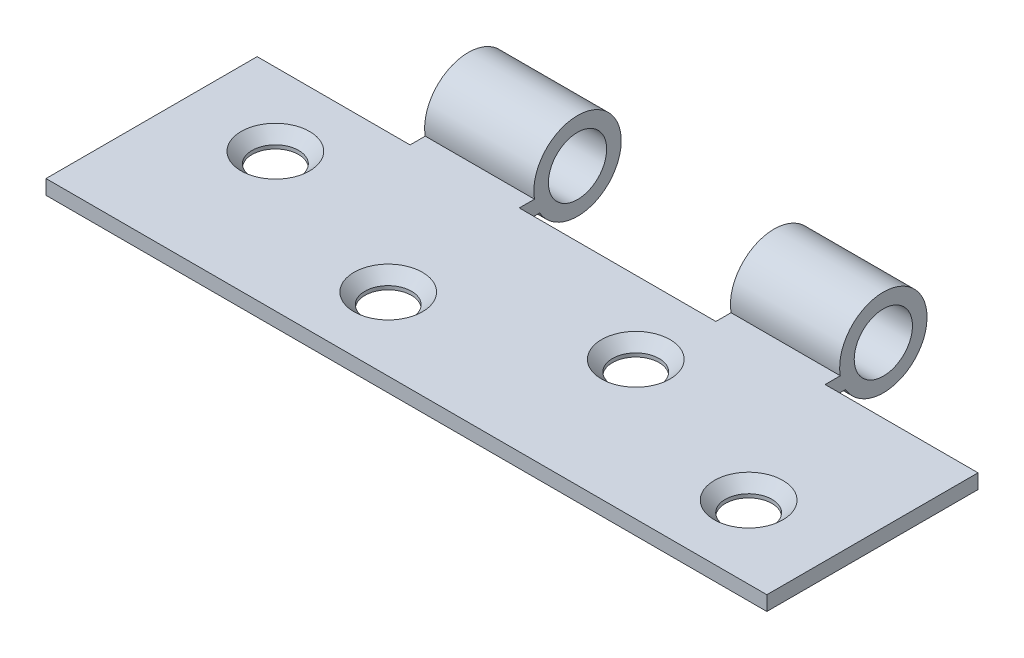
ISO-10303-21;
HEADER;
FILE_DESCRIPTION(('STEP AP214'),'2;1');
FILE_NAME('part.step','',(''),(''),'','','');
FILE_SCHEMA(('AUTOMOTIVE_DESIGN { 1 0 10303 214 1 1 1 1 }'));
ENDSEC;
DATA;
#1=APPLICATION_CONTEXT('core data for automotive mechanical design processes');
#2=APPLICATION_PROTOCOL_DEFINITION('international standard','automotive_design',2000,#1);
#3=PRODUCT_CONTEXT('',#1,'mechanical');
#4=PRODUCT('Part','Part','',(#3));
#5=PRODUCT_RELATED_PRODUCT_CATEGORY('part','',(#4));
#6=PRODUCT_DEFINITION_FORMATION('','',#4);
#7=PRODUCT_DEFINITION_CONTEXT('part definition',#1,'design');
#8=PRODUCT_DEFINITION('design','',#6,#7);
#9=PRODUCT_DEFINITION_SHAPE('','',#8);
#10=(LENGTH_UNIT() NAMED_UNIT(*) SI_UNIT(.MILLI.,.METRE.));
#11=(NAMED_UNIT(*) PLANE_ANGLE_UNIT() SI_UNIT($,.RADIAN.));
#12=(NAMED_UNIT(*) SI_UNIT($,.STERADIAN.) SOLID_ANGLE_UNIT());
#13=UNCERTAINTY_MEASURE_WITH_UNIT(LENGTH_MEASURE(1.E-05),#10,'distance_accuracy_value','');
#14=(GEOMETRIC_REPRESENTATION_CONTEXT(3) GLOBAL_UNCERTAINTY_ASSIGNED_CONTEXT((#13)) GLOBAL_UNIT_ASSIGNED_CONTEXT((#10,
#11,#12)) REPRESENTATION_CONTEXT('',''));
#15=CARTESIAN_POINT('',(0.,0.,0.));
#16=DIRECTION('',(0.,0.,1.));
#17=DIRECTION('',(1.,0.,0.));
#18=AXIS2_PLACEMENT_3D('',#15,#16,#17);
#19=CARTESIAN_POINT('',(99.,0.,0.));
#20=DIRECTION('',(-1.,0.,0.));
#21=DIRECTION('',(0.,0.,1.));
#22=AXIS2_PLACEMENT_3D('',#19,#20,#21);
#23=CYLINDRICAL_SURFACE('',#22,6.);
#24=CARTESIAN_POINT('',(36.,0.,0.));
#25=DIRECTION('',(-1.,0.,0.));
#26=DIRECTION('',(0.,0.,1.));
#27=AXIS2_PLACEMENT_3D('',#24,#25,#26);
#28=CIRCLE('',#27,6.);
#29=CARTESIAN_POINT('',(36.,-1.,5.91607978309962));
#30=VERTEX_POINT('',#29);
#31=CARTESIAN_POINT('',(36.,-3.00000000000001,5.19615242270663));
#32=VERTEX_POINT('',#31);
#33=EDGE_CURVE('E145',#30,#32,#28,.T.);
#34=ORIENTED_EDGE('',*,*,#33,.T.);
#35=DIRECTION('',(-1.,0.,0.));
#36=VECTOR('',#35,1.);
#37=CARTESIAN_POINT('',(99.,-3.,5.19615242270663));
#38=LINE('',#37,#36);
#39=CARTESIAN_POINT('',(21.,-3.00000000000001,5.19615242270663));
#40=VERTEX_POINT('',#39);
#41=EDGE_CURVE('E218',#40,#32,#38,.F.);
#42=ORIENTED_EDGE('',*,*,#41,.F.);
#43=CARTESIAN_POINT('',(21.,0.,0.));
#44=DIRECTION('',(1.,0.,0.));
#45=DIRECTION('',(0.,0.,-1.));
#46=AXIS2_PLACEMENT_3D('',#43,#44,#45);
#47=CIRCLE('',#46,6.);
#48=CARTESIAN_POINT('',(21.,-1.,5.91607978309962));
#49=VERTEX_POINT('',#48);
#50=EDGE_CURVE('E177',#40,#49,#47,.T.);
#51=ORIENTED_EDGE('',*,*,#50,.T.);
#52=DIRECTION('',(-1.,0.,0.));
#53=VECTOR('',#52,1.);
#54=CARTESIAN_POINT('',(99.,-1.,5.91607978309962));
#55=LINE('',#54,#53);
#56=EDGE_CURVE('E221',#30,#49,#55,.T.);
#57=ORIENTED_EDGE('',*,*,#56,.F.);
#58=EDGE_LOOP('',(#34,#42,#51,#57));
#59=FACE_BOUND('',#58,.T.);
#60=ADVANCED_FACE('F33',(#59),#23,.T.);
#61=CARTESIAN_POINT('',(63.,-3.,5.19615242270664));
#62=VERTEX_POINT('',#61);
#63=CARTESIAN_POINT('',(78.,-3.,5.19615242270664));
#64=VERTEX_POINT('',#63);
#65=EDGE_CURVE('E217',#62,#64,#38,.F.);
#66=ORIENTED_EDGE('',*,*,#65,.F.);
#67=CARTESIAN_POINT('',(63.,0.,0.));
#68=DIRECTION('',(1.,0.,0.));
#69=DIRECTION('',(0.,0.,-1.));
#70=AXIS2_PLACEMENT_3D('',#67,#68,#69);
#71=CIRCLE('',#70,6.);
#72=CARTESIAN_POINT('',(63.,-1.,5.91607978309962));
#73=VERTEX_POINT('',#72);
#74=EDGE_CURVE('E160',#62,#73,#71,.T.);
#75=ORIENTED_EDGE('',*,*,#74,.T.);
#76=CARTESIAN_POINT('',(78.,-1.,5.91607978309962));
#77=VERTEX_POINT('',#76);
#78=EDGE_CURVE('E223',#77,#73,#55,.T.);
#79=ORIENTED_EDGE('',*,*,#78,.F.);
#80=CARTESIAN_POINT('',(78.,0.,0.));
#81=DIRECTION('',(-1.,0.,0.));
#82=DIRECTION('',(0.,0.,1.));
#83=AXIS2_PLACEMENT_3D('',#80,#81,#82);
#84=CIRCLE('',#83,6.);
#85=EDGE_CURVE('E124',#77,#64,#84,.T.);
#86=ORIENTED_EDGE('',*,*,#85,.T.);
#87=EDGE_LOOP('',(#66,#75,#79,#86));
#88=FACE_BOUND('',#87,.T.);
#89=ADVANCED_FACE('F285',(#88),#23,.T.);
#90=CARTESIAN_POINT('',(99.,0.,0.));
#91=DIRECTION('',(-1.,0.,0.));
#92=DIRECTION('',(0.,0.,1.));
#93=AXIS2_PLACEMENT_3D('',#90,#91,#92);
#94=CYLINDRICAL_SURFACE('',#93,4.);
#95=CARTESIAN_POINT('',(36.,0.,0.));
#96=DIRECTION('',(-1.,0.,0.));
#97=DIRECTION('',(0.,0.,1.));
#98=AXIS2_PLACEMENT_3D('',#95,#96,#97);
#99=CIRCLE('',#98,4.);
#100=CARTESIAN_POINT('',(36.,0.,4.));
#101=VERTEX_POINT('',#100);
#102=EDGE_CURVE('E154',#101,#101,#99,.T.);
#103=ORIENTED_EDGE('',*,*,#102,.F.);
#104=EDGE_LOOP('',(#103));
#105=FACE_BOUND('',#104,.T.);
#106=CARTESIAN_POINT('',(21.,0.,0.));
#107=DIRECTION('',(1.,0.,0.));
#108=DIRECTION('',(0.,0.,-1.));
#109=AXIS2_PLACEMENT_3D('',#106,#107,#108);
#110=CIRCLE('',#109,4.);
#111=CARTESIAN_POINT('',(21.,0.,-4.));
#112=VERTEX_POINT('',#111);
#113=EDGE_CURVE('E183',#112,#112,#110,.T.);
#114=ORIENTED_EDGE('',*,*,#113,.F.);
#115=EDGE_LOOP('',(#114));
#116=FACE_BOUND('',#115,.T.);
#117=ADVANCED_FACE('F291',(#105,#116),#94,.F.);
#118=CARTESIAN_POINT('',(99.,0.,0.));
#119=DIRECTION('',(1.,0.,0.));
#120=DIRECTION('',(0.,0.,-1.));
#121=AXIS2_PLACEMENT_3D('',#118,#119,#120);
#122=PLANE('',#121);
#123=DIRECTION('',(0.,1.,0.));
#124=VECTOR('',#123,1.);
#125=CARTESIAN_POINT('',(99.,-6.,8.));
#126=LINE('',#125,#124);
#127=CARTESIAN_POINT('',(99.,-3.,8.));
#128=VERTEX_POINT('',#127);
#129=CARTESIAN_POINT('',(99.,-1.,8.));
#130=VERTEX_POINT('',#129);
#131=EDGE_CURVE('E138',#128,#130,#126,.T.);
#132=ORIENTED_EDGE('',*,*,#131,.T.);
#133=DIRECTION('',(0.,0.,-1.));
#134=VECTOR('',#133,1.);
#135=CARTESIAN_POINT('',(99.,-1.,37.));
#136=LINE('',#135,#134);
#137=CARTESIAN_POINT('',(99.,-1.,37.));
#138=VERTEX_POINT('',#137);
#139=EDGE_CURVE('E144',#138,#130,#136,.T.);
#140=ORIENTED_EDGE('',*,*,#139,.F.);
#141=DIRECTION('',(0.,1.,0.));
#142=VECTOR('',#141,1.);
#143=CARTESIAN_POINT('',(99.,-1.,37.));
#144=LINE('',#143,#142);
#145=CARTESIAN_POINT('',(99.,-3.,37.));
#146=VERTEX_POINT('',#145);
#147=EDGE_CURVE('E205',#146,#138,#144,.T.);
#148=ORIENTED_EDGE('',*,*,#147,.F.);
#149=DIRECTION('',(0.,0.,-1.));
#150=VECTOR('',#149,1.);
#151=CARTESIAN_POINT('',(99.,-3.,37.));
#152=LINE('',#151,#150);
#153=EDGE_CURVE('E208',#146,#128,#152,.T.);
#154=ORIENTED_EDGE('',*,*,#153,.T.);
#155=EDGE_LOOP('',(#132,#140,#148,#154));
#156=FACE_BOUND('',#155,.T.);
#157=ADVANCED_FACE('F339',(#156),#122,.T.);
#158=CARTESIAN_POINT('',(0.,0.,0.));
#159=DIRECTION('',(1.,0.,0.));
#160=DIRECTION('',(0.,0.,-1.));
#161=AXIS2_PLACEMENT_3D('',#158,#159,#160);
#162=PLANE('',#161);
#163=DIRECTION('',(0.,0.,-1.));
#164=VECTOR('',#163,1.);
#165=CARTESIAN_POINT('',(0.,-1.,37.));
#166=LINE('',#165,#164);
#167=CARTESIAN_POINT('',(0.,-1.,37.));
#168=VERTEX_POINT('',#167);
#169=CARTESIAN_POINT('',(0.,-1.,8.));
#170=VERTEX_POINT('',#169);
#171=EDGE_CURVE('E214',#168,#170,#166,.T.);
#172=ORIENTED_EDGE('',*,*,#171,.T.);
#173=DIRECTION('',(0.,1.,0.));
#174=VECTOR('',#173,1.);
#175=CARTESIAN_POINT('',(0.,-6.,8.));
#176=LINE('',#175,#174);
#177=CARTESIAN_POINT('',(0.,-3.00000000000001,8.));
#178=VERTEX_POINT('',#177);
#179=EDGE_CURVE('E169',#178,#170,#176,.T.);
#180=ORIENTED_EDGE('',*,*,#179,.F.);
#181=DIRECTION('',(0.,0.,-1.));
#182=VECTOR('',#181,1.);
#183=CARTESIAN_POINT('',(0.,-3.00000000000001,37.));
#184=LINE('',#183,#182);
#185=CARTESIAN_POINT('',(0.,-3.00000000000001,37.));
#186=VERTEX_POINT('',#185);
#187=EDGE_CURVE('E211',#186,#178,#184,.T.);
#188=ORIENTED_EDGE('',*,*,#187,.F.);
#189=DIRECTION('',(0.,-1.,0.));
#190=VECTOR('',#189,1.);
#191=CARTESIAN_POINT('',(0.,-1.,37.));
#192=LINE('',#191,#190);
#193=EDGE_CURVE('E201',#168,#186,#192,.T.);
#194=ORIENTED_EDGE('',*,*,#193,.F.);
#195=EDGE_LOOP('',(#172,#180,#188,#194));
#196=FACE_BOUND('',#195,.T.);
#197=ADVANCED_FACE('F274',(#196),#162,.F.);
#198=CARTESIAN_POINT('',(0.,-1.,37.));
#199=DIRECTION('',(0.,-1.,0.));
#200=DIRECTION('',(0.,0.,-1.));
#201=AXIS2_PLACEMENT_3D('',#198,#199,#200);
#202=PLANE('',#201);
#203=CARTESIAN_POINT('',(86.5,-1.,27.));
#204=DIRECTION('',(0.,-1.,0.));
#205=DIRECTION('',(0.,0.,-1.));
#206=AXIS2_PLACEMENT_3D('',#203,#204,#205);
#207=CIRCLE('',#206,4.69999999999997);
#208=CARTESIAN_POINT('',(86.5,-1.,22.3));
#209=VERTEX_POINT('',#208);
#210=EDGE_CURVE('E251',#209,#209,#207,.T.);
#211=ORIENTED_EDGE('',*,*,#210,.T.);
#212=EDGE_LOOP('',(#211));
#213=FACE_BOUND('',#212,.T.);
#214=CARTESIAN_POINT('',(62.,-1.,18.));
#215=DIRECTION('',(0.,-1.,0.));
#216=DIRECTION('',(0.,0.,-1.));
#217=AXIS2_PLACEMENT_3D('',#214,#215,#216);
#218=CIRCLE('',#217,4.69999999999996);
#219=CARTESIAN_POINT('',(62.,-1.,13.3));
#220=VERTEX_POINT('',#219);
#221=EDGE_CURVE('E248',#220,#220,#218,.T.);
#222=ORIENTED_EDGE('',*,*,#221,.T.);
#223=EDGE_LOOP('',(#222));
#224=FACE_BOUND('',#223,.T.);
#225=CARTESIAN_POINT('',(37.,-1.,27.));
#226=DIRECTION('',(0.,-1.,0.));
#227=DIRECTION('',(0.,0.,-1.));
#228=AXIS2_PLACEMENT_3D('',#225,#226,#227);
#229=CIRCLE('',#228,4.69999999999997);
#230=CARTESIAN_POINT('',(37.,-1.,22.3));
#231=VERTEX_POINT('',#230);
#232=EDGE_CURVE('E245',#231,#231,#229,.T.);
#233=ORIENTED_EDGE('',*,*,#232,.T.);
#234=EDGE_LOOP('',(#233));
#235=FACE_BOUND('',#234,.T.);
#236=CARTESIAN_POINT('',(12.5,-1.,18.));
#237=DIRECTION('',(0.,-1.,0.));
#238=DIRECTION('',(0.,0.,-1.));
#239=AXIS2_PLACEMENT_3D('',#236,#237,#238);
#240=CIRCLE('',#239,4.69999999999997);
#241=CARTESIAN_POINT('',(12.5,-1.,13.3));
#242=VERTEX_POINT('',#241);
#243=EDGE_CURVE('E242',#242,#242,#240,.T.);
#244=ORIENTED_EDGE('',*,*,#243,.T.);
#245=EDGE_LOOP('',(#244));
#246=FACE_BOUND('',#245,.T.);
#247=ORIENTED_EDGE('',*,*,#78,.T.);
#248=DIRECTION('',(0.,0.,1.));
#249=VECTOR('',#248,1.);
#250=CARTESIAN_POINT('',(63.,-1.,37.));
#251=LINE('',#250,#249);
#252=CARTESIAN_POINT('',(63.,-1.,8.));
#253=VERTEX_POINT('',#252);
#254=EDGE_CURVE('E163',#73,#253,#251,.T.);
#255=ORIENTED_EDGE('',*,*,#254,.T.);
#256=DIRECTION('',(-1.,0.,0.));
#257=VECTOR('',#256,1.);
#258=CARTESIAN_POINT('',(0.,-1.,8.));
#259=LINE('',#258,#257);
#260=CARTESIAN_POINT('',(36.,-1.,8.));
#261=VERTEX_POINT('',#260);
#262=EDGE_CURVE('E157',#253,#261,#259,.T.);
#263=ORIENTED_EDGE('',*,*,#262,.T.);
#264=DIRECTION('',(0.,0.,-1.));
#265=VECTOR('',#264,1.);
#266=CARTESIAN_POINT('',(36.,-1.,37.));
#267=LINE('',#266,#265);
#268=EDGE_CURVE('E147',#261,#30,#267,.T.);
#269=ORIENTED_EDGE('',*,*,#268,.T.);
#270=ORIENTED_EDGE('',*,*,#56,.T.);
#271=DIRECTION('',(0.,0.,1.));
#272=VECTOR('',#271,1.);
#273=CARTESIAN_POINT('',(21.,-1.,37.));
#274=LINE('',#273,#272);
#275=CARTESIAN_POINT('',(21.,-1.,7.99999999999999));
#276=VERTEX_POINT('',#275);
#277=EDGE_CURVE('E180',#49,#276,#274,.T.);
#278=ORIENTED_EDGE('',*,*,#277,.T.);
#279=DIRECTION('',(-1.,0.,0.));
#280=VECTOR('',#279,1.);
#281=CARTESIAN_POINT('',(0.,-1.,7.99999999999999));
#282=LINE('',#281,#280);
#283=EDGE_CURVE('E173',#276,#170,#282,.T.);
#284=ORIENTED_EDGE('',*,*,#283,.T.);
#285=ORIENTED_EDGE('',*,*,#171,.F.);
#286=DIRECTION('',(-1.,0.,0.));
#287=VECTOR('',#286,1.);
#288=CARTESIAN_POINT('',(0.,-1.,37.));
#289=LINE('',#288,#287);
#290=EDGE_CURVE('E198',#138,#168,#289,.T.);
#291=ORIENTED_EDGE('',*,*,#290,.F.);
#292=ORIENTED_EDGE('',*,*,#139,.T.);
#293=DIRECTION('',(-1.,0.,0.));
#294=VECTOR('',#293,1.);
#295=CARTESIAN_POINT('',(0.,-1.,7.99999999999999));
#296=LINE('',#295,#294);
#297=CARTESIAN_POINT('',(78.,-1.,7.99999999999999));
#298=VERTEX_POINT('',#297);
#299=EDGE_CURVE('E133',#130,#298,#296,.T.);
#300=ORIENTED_EDGE('',*,*,#299,.T.);
#301=DIRECTION('',(0.,0.,-1.));
#302=VECTOR('',#301,1.);
#303=CARTESIAN_POINT('',(78.,-1.,37.));
#304=LINE('',#303,#302);
#305=EDGE_CURVE('E122',#298,#77,#304,.T.);
#306=ORIENTED_EDGE('',*,*,#305,.T.);
#307=EDGE_LOOP('',(#247,#255,#263,#269,#270,#278,#284,#285,#291,#292,#300,#306));
#308=FACE_BOUND('',#307,.T.);
#309=ADVANCED_FACE('F141',(#213,#224,#235,#246,#308),#202,.F.);
#310=CARTESIAN_POINT('',(99.,-3.,37.));
#311=DIRECTION('',(0.,1.,0.));
#312=DIRECTION('',(-1.,0.,0.));
#313=AXIS2_PLACEMENT_3D('',#310,#311,#312);
#314=PLANE('',#313);
#315=CARTESIAN_POINT('',(37.,-3.00000000000001,27.));
#316=DIRECTION('',(0.,-1.,0.));
#317=DIRECTION('',(1.,0.,0.));
#318=AXIS2_PLACEMENT_3D('',#315,#316,#317);
#319=CIRCLE('',#318,3.2);
#320=CARTESIAN_POINT('',(40.2,-3.00000000000001,27.));
#321=VERTEX_POINT('',#320);
#322=EDGE_CURVE('E187',#321,#321,#319,.T.);
#323=ORIENTED_EDGE('',*,*,#322,.F.);
#324=EDGE_LOOP('',(#323));
#325=FACE_BOUND('',#324,.T.);
#326=CARTESIAN_POINT('',(62.,-3.,18.));
#327=DIRECTION('',(0.,-1.,0.));
#328=DIRECTION('',(1.,0.,0.));
#329=AXIS2_PLACEMENT_3D('',#326,#327,#328);
#330=CIRCLE('',#329,3.2);
#331=CARTESIAN_POINT('',(65.2,-3.,18.));
#332=VERTEX_POINT('',#331);
#333=EDGE_CURVE('E191',#332,#332,#330,.T.);
#334=ORIENTED_EDGE('',*,*,#333,.F.);
#335=EDGE_LOOP('',(#334));
#336=FACE_BOUND('',#335,.T.);
#337=CARTESIAN_POINT('',(86.5,-3.,27.));
#338=DIRECTION('',(0.,-1.,0.));
#339=DIRECTION('',(1.,0.,0.));
#340=AXIS2_PLACEMENT_3D('',#337,#338,#339);
#341=CIRCLE('',#340,3.2);
#342=CARTESIAN_POINT('',(89.7,-3.,27.));
#343=VERTEX_POINT('',#342);
#344=EDGE_CURVE('E186',#343,#343,#341,.T.);
#345=ORIENTED_EDGE('',*,*,#344,.F.);
#346=EDGE_LOOP('',(#345));
#347=FACE_BOUND('',#346,.T.);
#348=CARTESIAN_POINT('',(12.5,-3.00000000000001,18.));
#349=DIRECTION('',(0.,-1.,0.));
#350=DIRECTION('',(1.,0.,0.));
#351=AXIS2_PLACEMENT_3D('',#348,#349,#350);
#352=CIRCLE('',#351,3.2);
#353=CARTESIAN_POINT('',(15.7,-3.00000000000001,18.));
#354=VERTEX_POINT('',#353);
#355=EDGE_CURVE('E190',#354,#354,#352,.T.);
#356=ORIENTED_EDGE('',*,*,#355,.F.);
#357=EDGE_LOOP('',(#356));
#358=FACE_BOUND('',#357,.T.);
#359=DIRECTION('',(1.,0.,0.));
#360=VECTOR('',#359,1.);
#361=CARTESIAN_POINT('',(99.,-3.,8.));
#362=LINE('',#361,#360);
#363=CARTESIAN_POINT('',(36.,-3.00000000000001,8.));
#364=VERTEX_POINT('',#363);
#365=CARTESIAN_POINT('',(63.,-3.00000000000001,8.));
#366=VERTEX_POINT('',#365);
#367=EDGE_CURVE('E236',#364,#366,#362,.T.);
#368=ORIENTED_EDGE('',*,*,#367,.T.);
#369=DIRECTION('',(0.,0.,-1.));
#370=VECTOR('',#369,1.);
#371=CARTESIAN_POINT('',(63.,-3.,37.));
#372=LINE('',#371,#370);
#373=EDGE_CURVE('E239',#366,#62,#372,.T.);
#374=ORIENTED_EDGE('',*,*,#373,.T.);
#375=ORIENTED_EDGE('',*,*,#65,.T.);
#376=DIRECTION('',(0.,0.,1.));
#377=VECTOR('',#376,1.);
#378=CARTESIAN_POINT('',(78.,-3.,37.));
#379=LINE('',#378,#377);
#380=CARTESIAN_POINT('',(78.,-3.,7.99999999999999));
#381=VERTEX_POINT('',#380);
#382=EDGE_CURVE('E230',#64,#381,#379,.T.);
#383=ORIENTED_EDGE('',*,*,#382,.T.);
#384=DIRECTION('',(1.,0.,0.));
#385=VECTOR('',#384,1.);
#386=CARTESIAN_POINT('',(99.,-3.,7.99999999999999));
#387=LINE('',#386,#385);
#388=EDGE_CURVE('E136',#381,#128,#387,.T.);
#389=ORIENTED_EDGE('',*,*,#388,.T.);
#390=ORIENTED_EDGE('',*,*,#153,.F.);
#391=DIRECTION('',(1.,0.,0.));
#392=VECTOR('',#391,1.);
#393=CARTESIAN_POINT('',(99.,-3.,37.));
#394=LINE('',#393,#392);
#395=EDGE_CURVE('E203',#186,#146,#394,.T.);
#396=ORIENTED_EDGE('',*,*,#395,.F.);
#397=ORIENTED_EDGE('',*,*,#187,.T.);
#398=DIRECTION('',(1.,0.,0.));
#399=VECTOR('',#398,1.);
#400=CARTESIAN_POINT('',(99.,-3.,7.99999999999999));
#401=LINE('',#400,#399);
#402=CARTESIAN_POINT('',(21.,-3.00000000000001,7.99999999999999));
#403=VERTEX_POINT('',#402);
#404=EDGE_CURVE('E224',#178,#403,#401,.T.);
#405=ORIENTED_EDGE('',*,*,#404,.T.);
#406=DIRECTION('',(0.,0.,-1.));
#407=VECTOR('',#406,1.);
#408=CARTESIAN_POINT('',(21.,-3.00000000000001,37.));
#409=LINE('',#408,#407);
#410=EDGE_CURVE('E227',#403,#40,#409,.T.);
#411=ORIENTED_EDGE('',*,*,#410,.T.);
#412=ORIENTED_EDGE('',*,*,#41,.T.);
#413=DIRECTION('',(0.,0.,1.));
#414=VECTOR('',#413,1.);
#415=CARTESIAN_POINT('',(36.,-3.00000000000001,37.));
#416=LINE('',#415,#414);
#417=EDGE_CURVE('E233',#32,#364,#416,.T.);
#418=ORIENTED_EDGE('',*,*,#417,.T.);
#419=EDGE_LOOP('',(#368,#374,#375,#383,#389,#390,#396,#397,#405,#411,#412,#418));
#420=FACE_BOUND('',#419,.T.);
#421=ADVANCED_FACE('F273',(#325,#336,#347,#358,#420),#314,.F.);
#422=CARTESIAN_POINT('',(0.,0.,37.));
#423=DIRECTION('',(0.,0.,-1.));
#424=DIRECTION('',(-1.,0.,0.));
#425=AXIS2_PLACEMENT_3D('',#422,#423,#424);
#426=PLANE('',#425);
#427=ORIENTED_EDGE('',*,*,#290,.T.);
#428=ORIENTED_EDGE('',*,*,#193,.T.);
#429=ORIENTED_EDGE('',*,*,#395,.T.);
#430=ORIENTED_EDGE('',*,*,#147,.T.);
#431=EDGE_LOOP('',(#427,#428,#429,#430));
#432=FACE_BOUND('',#431,.T.);
#433=ADVANCED_FACE('F319',(#432),#426,.F.);
#434=CARTESIAN_POINT('',(12.5,34.,18.));
#435=DIRECTION('',(0.,-1.,0.));
#436=DIRECTION('',(1.,0.,0.));
#437=AXIS2_PLACEMENT_3D('',#434,#435,#436);
#438=CYLINDRICAL_SURFACE('',#437,3.2);
#439=CARTESIAN_POINT('',(12.5,-2.49999999999997,18.));
#440=DIRECTION('',(0.,-1.,0.));
#441=DIRECTION('',(1.,0.,0.));
#442=AXIS2_PLACEMENT_3D('',#439,#440,#441);
#443=CIRCLE('',#442,3.2);
#444=CARTESIAN_POINT('',(15.7,-2.49999999999997,18.));
#445=VERTEX_POINT('',#444);
#446=EDGE_CURVE('E11',#445,#445,#443,.F.);
#447=ORIENTED_EDGE('',*,*,#446,.T.);
#448=EDGE_LOOP('',(#447));
#449=FACE_BOUND('',#448,.T.);
#450=ORIENTED_EDGE('',*,*,#355,.T.);
#451=EDGE_LOOP('',(#450));
#452=FACE_BOUND('',#451,.T.);
#453=ADVANCED_FACE('F373',(#449,#452),#438,.F.);
#454=CARTESIAN_POINT('',(86.5,34.,27.));
#455=DIRECTION('',(0.,-1.,0.));
#456=DIRECTION('',(1.,0.,0.));
#457=AXIS2_PLACEMENT_3D('',#454,#455,#456);
#458=CYLINDRICAL_SURFACE('',#457,3.2);
#459=CARTESIAN_POINT('',(86.5,-2.49999999999998,27.));
#460=DIRECTION('',(0.,-1.,0.));
#461=DIRECTION('',(0.,0.,-1.));
#462=AXIS2_PLACEMENT_3D('',#459,#460,#461);
#463=CIRCLE('',#462,3.2);
#464=CARTESIAN_POINT('',(86.5,-2.49999999999998,23.8));
#465=VERTEX_POINT('',#464);
#466=EDGE_CURVE('E254',#465,#465,#463,.F.);
#467=ORIENTED_EDGE('',*,*,#466,.T.);
#468=EDGE_LOOP('',(#467));
#469=FACE_BOUND('',#468,.T.);
#470=ORIENTED_EDGE('',*,*,#344,.T.);
#471=EDGE_LOOP('',(#470));
#472=FACE_BOUND('',#471,.T.);
#473=ADVANCED_FACE('F313',(#469,#472),#458,.F.);
#474=CARTESIAN_POINT('',(62.,34.,18.));
#475=DIRECTION('',(0.,-1.,0.));
#476=DIRECTION('',(1.,0.,0.));
#477=AXIS2_PLACEMENT_3D('',#474,#475,#476);
#478=CYLINDRICAL_SURFACE('',#477,3.2);
#479=CARTESIAN_POINT('',(62.,-2.49999999999997,18.));
#480=DIRECTION('',(0.,-1.,0.));
#481=DIRECTION('',(0.,0.,-1.));
#482=AXIS2_PLACEMENT_3D('',#479,#480,#481);
#483=CIRCLE('',#482,3.2);
#484=CARTESIAN_POINT('',(62.,-2.49999999999997,14.8));
#485=VERTEX_POINT('',#484);
#486=EDGE_CURVE('E257',#485,#485,#483,.F.);
#487=ORIENTED_EDGE('',*,*,#486,.T.);
#488=EDGE_LOOP('',(#487));
#489=FACE_BOUND('',#488,.T.);
#490=ORIENTED_EDGE('',*,*,#333,.T.);
#491=EDGE_LOOP('',(#490));
#492=FACE_BOUND('',#491,.T.);
#493=ADVANCED_FACE('F310',(#489,#492),#478,.F.);
#494=CARTESIAN_POINT('',(37.,34.,27.));
#495=DIRECTION('',(0.,-1.,0.));
#496=DIRECTION('',(1.,0.,0.));
#497=AXIS2_PLACEMENT_3D('',#494,#495,#496);
#498=CYLINDRICAL_SURFACE('',#497,3.2);
#499=CARTESIAN_POINT('',(37.,-2.49999999999997,27.));
#500=DIRECTION('',(0.,-1.,0.));
#501=DIRECTION('',(0.,0.,-1.));
#502=AXIS2_PLACEMENT_3D('',#499,#500,#501);
#503=CIRCLE('',#502,3.2);
#504=CARTESIAN_POINT('',(37.,-2.49999999999997,23.8));
#505=VERTEX_POINT('',#504);
#506=EDGE_CURVE('E41',#505,#505,#503,.F.);
#507=ORIENTED_EDGE('',*,*,#506,.T.);
#508=EDGE_LOOP('',(#507));
#509=FACE_BOUND('',#508,.T.);
#510=ORIENTED_EDGE('',*,*,#322,.T.);
#511=EDGE_LOOP('',(#510));
#512=FACE_BOUND('',#511,.T.);
#513=ADVANCED_FACE('F262',(#509,#512),#498,.F.);
#514=CARTESIAN_POINT('',(21.,-6.,-6.));
#515=DIRECTION('',(1.,0.,0.));
#516=DIRECTION('',(0.,0.,-1.));
#517=AXIS2_PLACEMENT_3D('',#514,#515,#516);
#518=PLANE('',#517);
#519=ORIENTED_EDGE('',*,*,#113,.T.);
#520=EDGE_LOOP('',(#519));
#521=FACE_BOUND('',#520,.T.);
#522=ORIENTED_EDGE('',*,*,#50,.F.);
#523=ORIENTED_EDGE('',*,*,#410,.F.);
#524=DIRECTION('',(0.,1.,0.));
#525=VECTOR('',#524,1.);
#526=CARTESIAN_POINT('',(21.,-6.,7.99999999999999));
#527=LINE('',#526,#525);
#528=EDGE_CURVE('E170',#403,#276,#527,.T.);
#529=ORIENTED_EDGE('',*,*,#528,.T.);
#530=ORIENTED_EDGE('',*,*,#277,.F.);
#531=EDGE_LOOP('',(#522,#523,#529,#530));
#532=FACE_BOUND('',#531,.T.);
#533=ADVANCED_FACE('F362',(#521,#532),#518,.F.);
#534=CARTESIAN_POINT('',(21.,-6.,7.99999999999999));
#535=DIRECTION('',(0.,0.,1.));
#536=DIRECTION('',(1.,0.,0.));
#537=AXIS2_PLACEMENT_3D('',#534,#535,#536);
#538=PLANE('',#537);
#539=ORIENTED_EDGE('',*,*,#528,.F.);
#540=ORIENTED_EDGE('',*,*,#404,.F.);
#541=ORIENTED_EDGE('',*,*,#179,.T.);
#542=ORIENTED_EDGE('',*,*,#283,.F.);
#543=EDGE_LOOP('',(#539,#540,#541,#542));
#544=FACE_BOUND('',#543,.T.);
#545=ADVANCED_FACE('F360',(#544),#538,.F.);
#546=CARTESIAN_POINT('',(78.,-6.,7.99999999999999));
#547=DIRECTION('',(0.,0.,1.));
#548=DIRECTION('',(1.,0.,0.));
#549=AXIS2_PLACEMENT_3D('',#546,#547,#548);
#550=PLANE('',#549);
#551=ORIENTED_EDGE('',*,*,#131,.F.);
#552=ORIENTED_EDGE('',*,*,#388,.F.);
#553=DIRECTION('',(0.,1.,0.));
#554=VECTOR('',#553,1.);
#555=CARTESIAN_POINT('',(78.,-6.,7.99999999999999));
#556=LINE('',#555,#554);
#557=EDGE_CURVE('E56',#381,#298,#556,.T.);
#558=ORIENTED_EDGE('',*,*,#557,.T.);
#559=ORIENTED_EDGE('',*,*,#299,.F.);
#560=EDGE_LOOP('',(#551,#552,#558,#559));
#561=FACE_BOUND('',#560,.T.);
#562=ADVANCED_FACE('F132',(#561),#550,.F.);
#563=CARTESIAN_POINT('',(78.,-6.,-6.));
#564=DIRECTION('',(-1.,0.,0.));
#565=DIRECTION('',(0.,0.,1.));
#566=AXIS2_PLACEMENT_3D('',#563,#564,#565);
#567=PLANE('',#566);
#568=CARTESIAN_POINT('',(78.,0.,0.));
#569=DIRECTION('',(-1.,0.,0.));
#570=DIRECTION('',(0.,0.,1.));
#571=AXIS2_PLACEMENT_3D('',#568,#569,#570);
#572=CIRCLE('',#571,4.);
#573=CARTESIAN_POINT('',(78.,0.,4.));
#574=VERTEX_POINT('',#573);
#575=EDGE_CURVE('E129',#574,#574,#572,.T.);
#576=ORIENTED_EDGE('',*,*,#575,.T.);
#577=EDGE_LOOP('',(#576));
#578=FACE_BOUND('',#577,.T.);
#579=ORIENTED_EDGE('',*,*,#557,.F.);
#580=ORIENTED_EDGE('',*,*,#382,.F.);
#581=ORIENTED_EDGE('',*,*,#85,.F.);
#582=ORIENTED_EDGE('',*,*,#305,.F.);
#583=EDGE_LOOP('',(#579,#580,#581,#582));
#584=FACE_BOUND('',#583,.T.);
#585=ADVANCED_FACE('F123',(#578,#584),#567,.F.);
#586=CARTESIAN_POINT('',(63.,-6.,8.));
#587=DIRECTION('',(1.,0.,0.));
#588=DIRECTION('',(0.,0.,-1.));
#589=AXIS2_PLACEMENT_3D('',#586,#587,#588);
#590=PLANE('',#589);
#591=CARTESIAN_POINT('',(63.,0.,0.));
#592=DIRECTION('',(1.,0.,0.));
#593=DIRECTION('',(0.,0.,-1.));
#594=AXIS2_PLACEMENT_3D('',#591,#592,#593);
#595=CIRCLE('',#594,4.);
#596=CARTESIAN_POINT('',(63.,0.,-4.));
#597=VERTEX_POINT('',#596);
#598=EDGE_CURVE('E166',#597,#597,#595,.T.);
#599=ORIENTED_EDGE('',*,*,#598,.T.);
#600=EDGE_LOOP('',(#599));
#601=FACE_BOUND('',#600,.T.);
#602=ORIENTED_EDGE('',*,*,#74,.F.);
#603=ORIENTED_EDGE('',*,*,#373,.F.);
#604=DIRECTION('',(0.,1.,0.));
#605=VECTOR('',#604,1.);
#606=CARTESIAN_POINT('',(63.,-6.,8.));
#607=LINE('',#606,#605);
#608=EDGE_CURVE('E332',#366,#253,#607,.T.);
#609=ORIENTED_EDGE('',*,*,#608,.T.);
#610=ORIENTED_EDGE('',*,*,#254,.F.);
#611=EDGE_LOOP('',(#602,#603,#609,#610));
#612=FACE_BOUND('',#611,.T.);
#613=ADVANCED_FACE('F343',(#601,#612),#590,.F.);
#614=CARTESIAN_POINT('',(36.,-6.,8.));
#615=DIRECTION('',(0.,0.,1.));
#616=DIRECTION('',(1.,0.,0.));
#617=AXIS2_PLACEMENT_3D('',#614,#615,#616);
#618=PLANE('',#617);
#619=ORIENTED_EDGE('',*,*,#608,.F.);
#620=ORIENTED_EDGE('',*,*,#367,.F.);
#621=DIRECTION('',(0.,1.,0.));
#622=VECTOR('',#621,1.);
#623=CARTESIAN_POINT('',(36.,-6.,8.));
#624=LINE('',#623,#622);
#625=EDGE_CURVE('E48',#364,#261,#624,.T.);
#626=ORIENTED_EDGE('',*,*,#625,.T.);
#627=ORIENTED_EDGE('',*,*,#262,.F.);
#628=EDGE_LOOP('',(#619,#620,#626,#627));
#629=FACE_BOUND('',#628,.T.);
#630=ADVANCED_FACE('F330',(#629),#618,.F.);
#631=CARTESIAN_POINT('',(36.,-6.,-6.));
#632=DIRECTION('',(-1.,0.,0.));
#633=DIRECTION('',(0.,0.,1.));
#634=AXIS2_PLACEMENT_3D('',#631,#632,#633);
#635=PLANE('',#634);
#636=ORIENTED_EDGE('',*,*,#102,.T.);
#637=EDGE_LOOP('',(#636));
#638=FACE_BOUND('',#637,.T.);
#639=ORIENTED_EDGE('',*,*,#625,.F.);
#640=ORIENTED_EDGE('',*,*,#417,.F.);
#641=ORIENTED_EDGE('',*,*,#33,.F.);
#642=ORIENTED_EDGE('',*,*,#268,.F.);
#643=EDGE_LOOP('',(#639,#640,#641,#642));
#644=FACE_BOUND('',#643,.T.);
#645=ADVANCED_FACE('F351',(#638,#644),#635,.F.);
#646=ORIENTED_EDGE('',*,*,#598,.F.);
#647=EDGE_LOOP('',(#646));
#648=FACE_BOUND('',#647,.T.);
#649=ORIENTED_EDGE('',*,*,#575,.F.);
#650=EDGE_LOOP('',(#649));
#651=FACE_BOUND('',#650,.T.);
#652=ADVANCED_FACE('F299',(#648,#651),#94,.F.);
#653=CARTESIAN_POINT('',(86.5,-1.,27.));
#654=DIRECTION('',(0.,1.,0.));
#655=DIRECTION('',(0.,0.,1.));
#656=AXIS2_PLACEMENT_3D('',#653,#654,#655);
#657=CONICAL_SURFACE('',#656,4.69999999999997,0.785398163397446);
#658=ORIENTED_EDGE('',*,*,#466,.F.);
#659=EDGE_LOOP('',(#658));
#660=FACE_BOUND('',#659,.T.);
#661=ORIENTED_EDGE('',*,*,#210,.F.);
#662=EDGE_LOOP('',(#661));
#663=FACE_BOUND('',#662,.T.);
#664=ADVANCED_FACE('F296',(#660,#663),#657,.F.);
#665=CARTESIAN_POINT('',(62.,-1.,18.));
#666=DIRECTION('',(0.,1.,0.));
#667=DIRECTION('',(0.,0.,1.));
#668=AXIS2_PLACEMENT_3D('',#665,#666,#667);
#669=CONICAL_SURFACE('',#668,4.69999999999996,0.785398163397444);
#670=ORIENTED_EDGE('',*,*,#486,.F.);
#671=EDGE_LOOP('',(#670));
#672=FACE_BOUND('',#671,.T.);
#673=ORIENTED_EDGE('',*,*,#221,.F.);
#674=EDGE_LOOP('',(#673));
#675=FACE_BOUND('',#674,.T.);
#676=ADVANCED_FACE('F268',(#672,#675),#669,.F.);
#677=CARTESIAN_POINT('',(37.,-1.,27.));
#678=DIRECTION('',(0.,1.,0.));
#679=DIRECTION('',(0.,0.,1.));
#680=AXIS2_PLACEMENT_3D('',#677,#678,#679);
#681=CONICAL_SURFACE('',#680,4.69999999999997,0.785398163397445);
#682=ORIENTED_EDGE('',*,*,#506,.F.);
#683=EDGE_LOOP('',(#682));
#684=FACE_BOUND('',#683,.T.);
#685=ORIENTED_EDGE('',*,*,#232,.F.);
#686=EDGE_LOOP('',(#685));
#687=FACE_BOUND('',#686,.T.);
#688=ADVANCED_FACE('F265',(#684,#687),#681,.F.);
#689=CARTESIAN_POINT('',(12.5,-1.,18.));
#690=DIRECTION('',(0.,1.,0.));
#691=DIRECTION('',(-1.,0.,0.));
#692=AXIS2_PLACEMENT_3D('',#689,#690,#691);
#693=CONICAL_SURFACE('',#692,4.69999999999997,0.785398163397446);
#694=ORIENTED_EDGE('',*,*,#446,.F.);
#695=EDGE_LOOP('',(#694));
#696=FACE_BOUND('',#695,.T.);
#697=ORIENTED_EDGE('',*,*,#243,.F.);
#698=EDGE_LOOP('',(#697));
#699=FACE_BOUND('',#698,.T.);
#700=ADVANCED_FACE('F35',(#696,#699),#693,.F.);
#701=CLOSED_SHELL('',(#60,#89,#117,#157,#197,#309,#421,#433,#453,#473,#493,#513,#533,#545,#562,
#585,#613,#630,#645,#652,#664,#676,#688,#700));
#702=MANIFOLD_SOLID_BREP('B2',#701);
#703=ADVANCED_BREP_SHAPE_REPRESENTATION('',(#18,#702),#14);
#704=SHAPE_DEFINITION_REPRESENTATION(#9,#703);
ENDSEC;
END-ISO-10303-21;
